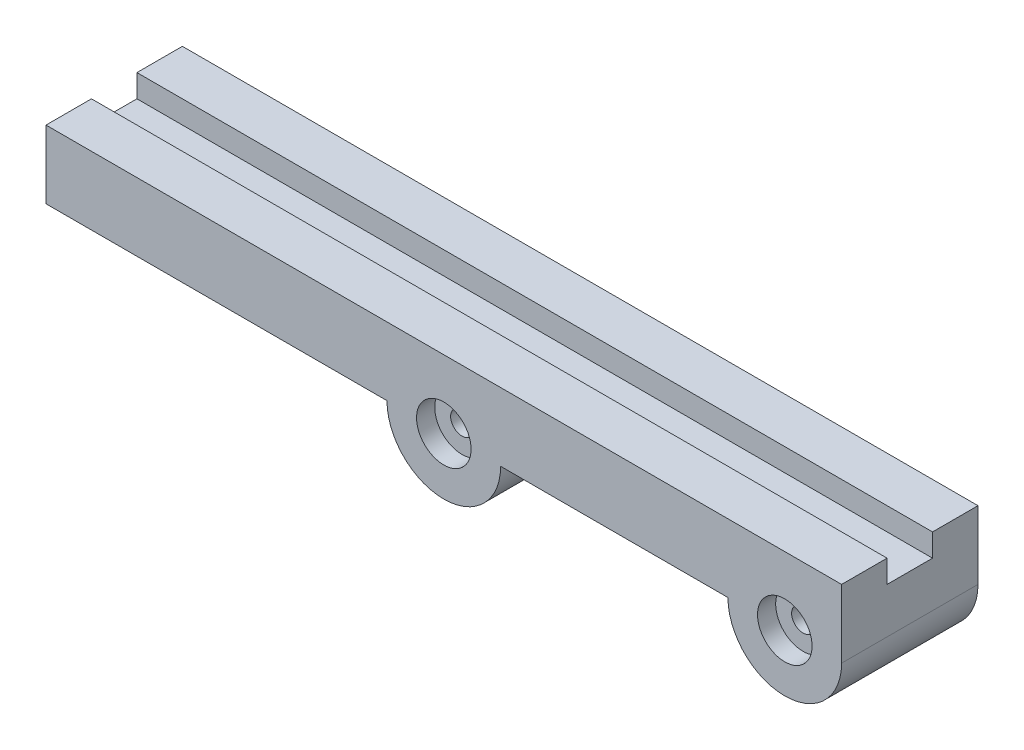
ISO-10303-21;
HEADER;
FILE_DESCRIPTION(('STEP AP214'),'2;1');
FILE_NAME('part.step','',(''),(''),'','','');
FILE_SCHEMA(('AUTOMOTIVE_DESIGN { 1 0 10303 214 1 1 1 1 }'));
ENDSEC;
DATA;
#1=APPLICATION_CONTEXT('core data for automotive mechanical design processes');
#2=APPLICATION_PROTOCOL_DEFINITION('international standard','automotive_design',2000,#1);
#3=PRODUCT_CONTEXT('',#1,'mechanical');
#4=PRODUCT('Part','Part','',(#3));
#5=PRODUCT_RELATED_PRODUCT_CATEGORY('part','',(#4));
#6=PRODUCT_DEFINITION_FORMATION('','',#4);
#7=PRODUCT_DEFINITION_CONTEXT('part definition',#1,'design');
#8=PRODUCT_DEFINITION('design','',#6,#7);
#9=PRODUCT_DEFINITION_SHAPE('','',#8);
#10=(LENGTH_UNIT() NAMED_UNIT(*) SI_UNIT(.MILLI.,.METRE.));
#11=(NAMED_UNIT(*) PLANE_ANGLE_UNIT() SI_UNIT($,.RADIAN.));
#12=(NAMED_UNIT(*) SI_UNIT($,.STERADIAN.) SOLID_ANGLE_UNIT());
#13=UNCERTAINTY_MEASURE_WITH_UNIT(LENGTH_MEASURE(1.E-05),#10,'distance_accuracy_value','');
#14=(GEOMETRIC_REPRESENTATION_CONTEXT(3) GLOBAL_UNCERTAINTY_ASSIGNED_CONTEXT((#13)) GLOBAL_UNIT_ASSIGNED_CONTEXT((#10,
#11,#12)) REPRESENTATION_CONTEXT('',''));
#15=CARTESIAN_POINT('',(0.,0.,0.));
#16=DIRECTION('',(0.,0.,1.));
#17=DIRECTION('',(1.,0.,0.));
#18=AXIS2_PLACEMENT_3D('',#15,#16,#17);
#19=CARTESIAN_POINT('',(0.,15.,30.));
#20=DIRECTION('',(0.,1.,0.));
#21=DIRECTION('',(-1.,0.,0.));
#22=AXIS2_PLACEMENT_3D('',#19,#20,#21);
#23=PLANE('',#22);
#24=DIRECTION('',(1.,0.,0.));
#25=VECTOR('',#24,1.);
#26=CARTESIAN_POINT('',(0.,15.,20.));
#27=LINE('',#26,#25);
#28=CARTESIAN_POINT('',(0.,15.,20.));
#29=VERTEX_POINT('',#28);
#30=CARTESIAN_POINT('',(175.,15.,20.));
#31=VERTEX_POINT('',#30);
#32=EDGE_CURVE('E274',#29,#31,#27,.T.);
#33=ORIENTED_EDGE('',*,*,#32,.F.);
#34=DIRECTION('',(0.,0.,-1.));
#35=VECTOR('',#34,1.);
#36=CARTESIAN_POINT('',(0.,15.,30.));
#37=LINE('',#36,#35);
#38=CARTESIAN_POINT('',(0.,15.,30.));
#39=VERTEX_POINT('',#38);
#40=EDGE_CURVE('E183',#39,#29,#37,.T.);
#41=ORIENTED_EDGE('',*,*,#40,.F.);
#42=DIRECTION('',(1.,0.,0.));
#43=VECTOR('',#42,1.);
#44=CARTESIAN_POINT('',(0.,15.,30.));
#45=LINE('',#44,#43);
#46=CARTESIAN_POINT('',(175.,15.,30.));
#47=VERTEX_POINT('',#46);
#48=EDGE_CURVE('E147',#39,#47,#45,.T.);
#49=ORIENTED_EDGE('',*,*,#48,.T.);
#50=DIRECTION('',(0.,0.,-1.));
#51=VECTOR('',#50,1.);
#52=CARTESIAN_POINT('',(175.,15.,30.));
#53=LINE('',#52,#51);
#54=EDGE_CURVE('E187',#47,#31,#53,.T.);
#55=ORIENTED_EDGE('',*,*,#54,.T.);
#56=EDGE_LOOP('',(#33,#41,#49,#55));
#57=FACE_BOUND('',#56,.T.);
#58=ADVANCED_FACE('F45',(#57),#23,.T.);
#59=CARTESIAN_POINT('',(162.5,0.,-0.001000000000001));
#60=DIRECTION('',(0.,0.,1.));
#61=DIRECTION('',(1.,0.,0.));
#62=AXIS2_PLACEMENT_3D('',#59,#60,#61);
#63=CYLINDRICAL_SURFACE('',#62,2.5);
#64=CARTESIAN_POINT('',(162.5,0.,0.));
#65=DIRECTION('',(0.,0.,1.));
#66=DIRECTION('',(1.,0.,0.));
#67=AXIS2_PLACEMENT_3D('',#64,#65,#66);
#68=CIRCLE('',#67,2.5);
#69=CARTESIAN_POINT('',(165.,0.,0.));
#70=VERTEX_POINT('',#69);
#71=EDGE_CURVE('E244',#70,#70,#68,.F.);
#72=ORIENTED_EDGE('',*,*,#71,.T.);
#73=EDGE_LOOP('',(#72));
#74=FACE_BOUND('',#73,.T.);
#75=CARTESIAN_POINT('',(162.5,0.,26.));
#76=DIRECTION('',(0.,0.,1.));
#77=DIRECTION('',(1.,0.,0.));
#78=AXIS2_PLACEMENT_3D('',#75,#76,#77);
#79=CIRCLE('',#78,2.5);
#80=CARTESIAN_POINT('',(165.,0.,26.));
#81=VERTEX_POINT('',#80);
#82=EDGE_CURVE('E249',#81,#81,#79,.T.);
#83=ORIENTED_EDGE('',*,*,#82,.T.);
#84=EDGE_LOOP('',(#83));
#85=FACE_BOUND('',#84,.T.);
#86=ADVANCED_FACE('F315',(#74,#85),#63,.F.);
#87=CARTESIAN_POINT('',(87.5,0.,-0.001000000000001));
#88=DIRECTION('',(0.,0.,1.));
#89=DIRECTION('',(1.,0.,0.));
#90=AXIS2_PLACEMENT_3D('',#87,#88,#89);
#91=CYLINDRICAL_SURFACE('',#90,2.5);
#92=CARTESIAN_POINT('',(87.5,0.,0.));
#93=DIRECTION('',(0.,0.,1.));
#94=DIRECTION('',(1.,0.,0.));
#95=AXIS2_PLACEMENT_3D('',#92,#93,#94);
#96=CIRCLE('',#95,2.5);
#97=CARTESIAN_POINT('',(90.,0.,0.));
#98=VERTEX_POINT('',#97);
#99=EDGE_CURVE('E163',#98,#98,#96,.F.);
#100=ORIENTED_EDGE('',*,*,#99,.T.);
#101=EDGE_LOOP('',(#100));
#102=FACE_BOUND('',#101,.T.);
#103=CARTESIAN_POINT('',(87.5,0.,26.));
#104=DIRECTION('',(0.,0.,1.));
#105=DIRECTION('',(1.,0.,0.));
#106=AXIS2_PLACEMENT_3D('',#103,#104,#105);
#107=CIRCLE('',#106,2.5);
#108=CARTESIAN_POINT('',(90.,0.,26.));
#109=VERTEX_POINT('',#108);
#110=EDGE_CURVE('E235',#109,#109,#107,.T.);
#111=ORIENTED_EDGE('',*,*,#110,.T.);
#112=EDGE_LOOP('',(#111));
#113=FACE_BOUND('',#112,.T.);
#114=ADVANCED_FACE('F312',(#102,#113),#91,.F.);
#115=CARTESIAN_POINT('',(0.,0.,30.));
#116=DIRECTION('',(0.,1.,0.));
#117=DIRECTION('',(-1.,0.,0.));
#118=AXIS2_PLACEMENT_3D('',#115,#116,#117);
#119=PLANE('',#118);
#120=DIRECTION('',(1.,0.,0.));
#121=VECTOR('',#120,1.);
#122=CARTESIAN_POINT('',(0.,0.,0.));
#123=LINE('',#122,#121);
#124=CARTESIAN_POINT('',(100.,0.,0.));
#125=VERTEX_POINT('',#124);
#126=CARTESIAN_POINT('',(150.,0.,0.));
#127=VERTEX_POINT('',#126);
#128=EDGE_CURVE('E158',#125,#127,#123,.T.);
#129=ORIENTED_EDGE('',*,*,#128,.T.);
#130=DIRECTION('',(0.,0.,-1.));
#131=VECTOR('',#130,1.);
#132=CARTESIAN_POINT('',(150.,0.,30.));
#133=LINE('',#132,#131);
#134=CARTESIAN_POINT('',(150.,0.,30.));
#135=VERTEX_POINT('',#134);
#136=EDGE_CURVE('E11',#135,#127,#133,.T.);
#137=ORIENTED_EDGE('',*,*,#136,.F.);
#138=DIRECTION('',(1.,0.,0.));
#139=VECTOR('',#138,1.);
#140=CARTESIAN_POINT('',(0.,0.,30.));
#141=LINE('',#140,#139);
#142=CARTESIAN_POINT('',(100.,0.,30.));
#143=VERTEX_POINT('',#142);
#144=EDGE_CURVE('E143',#143,#135,#141,.T.);
#145=ORIENTED_EDGE('',*,*,#144,.F.);
#146=DIRECTION('',(0.,0.,-1.));
#147=VECTOR('',#146,1.);
#148=CARTESIAN_POINT('',(100.,0.,30.));
#149=LINE('',#148,#147);
#150=EDGE_CURVE('E157',#143,#125,#149,.T.);
#151=ORIENTED_EDGE('',*,*,#150,.T.);
#152=EDGE_LOOP('',(#129,#137,#145,#151));
#153=FACE_BOUND('',#152,.T.);
#154=ADVANCED_FACE('F304',(#153),#119,.F.);
#155=CARTESIAN_POINT('',(162.5,0.,30.));
#156=DIRECTION('',(0.,0.,-1.));
#157=DIRECTION('',(-1.,0.,0.));
#158=AXIS2_PLACEMENT_3D('',#155,#156,#157);
#159=CYLINDRICAL_SURFACE('',#158,12.5);
#160=CARTESIAN_POINT('',(162.5,0.,0.));
#161=DIRECTION('',(0.,0.,1.));
#162=DIRECTION('',(1.,0.,0.));
#163=AXIS2_PLACEMENT_3D('',#160,#161,#162);
#164=CIRCLE('',#163,12.5);
#165=CARTESIAN_POINT('',(175.,0.,0.));
#166=VERTEX_POINT('',#165);
#167=EDGE_CURVE('E162',#127,#166,#164,.T.);
#168=ORIENTED_EDGE('',*,*,#167,.T.);
#169=DIRECTION('',(0.,0.,-1.));
#170=VECTOR('',#169,1.);
#171=CARTESIAN_POINT('',(175.,0.,30.));
#172=LINE('',#171,#170);
#173=CARTESIAN_POINT('',(175.,0.,30.));
#174=VERTEX_POINT('',#173);
#175=EDGE_CURVE('E54',#174,#166,#172,.T.);
#176=ORIENTED_EDGE('',*,*,#175,.F.);
#177=CARTESIAN_POINT('',(162.5,0.,30.));
#178=DIRECTION('',(0.,0.,1.));
#179=DIRECTION('',(1.,0.,0.));
#180=AXIS2_PLACEMENT_3D('',#177,#178,#179);
#181=CIRCLE('',#180,12.5);
#182=EDGE_CURVE('E108',#135,#174,#181,.T.);
#183=ORIENTED_EDGE('',*,*,#182,.F.);
#184=ORIENTED_EDGE('',*,*,#136,.T.);
#185=EDGE_LOOP('',(#168,#176,#183,#184));
#186=FACE_BOUND('',#185,.T.);
#187=ADVANCED_FACE('F47',(#186),#159,.T.);
#188=CARTESIAN_POINT('',(175.,3.23815048849004E-13,30.));
#189=DIRECTION('',(-1.,0.,0.));
#190=DIRECTION('',(0.,-1.,0.));
#191=AXIS2_PLACEMENT_3D('',#188,#189,#190);
#192=PLANE('',#191);
#193=DIRECTION('',(0.,0.,-1.));
#194=VECTOR('',#193,1.);
#195=CARTESIAN_POINT('',(175.,10.,20.));
#196=LINE('',#195,#194);
#197=CARTESIAN_POINT('',(175.,10.,20.));
#198=VERTEX_POINT('',#197);
#199=CARTESIAN_POINT('',(175.,10.,10.));
#200=VERTEX_POINT('',#199);
#201=EDGE_CURVE('E285',#198,#200,#196,.T.);
#202=ORIENTED_EDGE('',*,*,#201,.F.);
#203=DIRECTION('',(0.,1.,0.));
#204=VECTOR('',#203,1.);
#205=CARTESIAN_POINT('',(175.,10.,20.));
#206=LINE('',#205,#204);
#207=EDGE_CURVE('E228',#198,#31,#206,.T.);
#208=ORIENTED_EDGE('',*,*,#207,.T.);
#209=ORIENTED_EDGE('',*,*,#54,.F.);
#210=DIRECTION('',(0.,1.,0.));
#211=VECTOR('',#210,1.);
#212=CARTESIAN_POINT('',(175.,3.23815048849004E-13,30.));
#213=LINE('',#212,#211);
#214=EDGE_CURVE('E151',#174,#47,#213,.T.);
#215=ORIENTED_EDGE('',*,*,#214,.F.);
#216=ORIENTED_EDGE('',*,*,#175,.T.);
#217=DIRECTION('',(0.,1.,0.));
#218=VECTOR('',#217,1.);
#219=CARTESIAN_POINT('',(175.,3.23815048849004E-13,0.));
#220=LINE('',#219,#218);
#221=CARTESIAN_POINT('',(175.,15.,0.));
#222=VERTEX_POINT('',#221);
#223=EDGE_CURVE('E167',#166,#222,#220,.T.);
#224=ORIENTED_EDGE('',*,*,#223,.T.);
#225=CARTESIAN_POINT('',(175.,15.,10.));
#226=VERTEX_POINT('',#225);
#227=EDGE_CURVE('E186',#226,#222,#53,.T.);
#228=ORIENTED_EDGE('',*,*,#227,.F.);
#229=DIRECTION('',(0.,1.,0.));
#230=VECTOR('',#229,1.);
#231=CARTESIAN_POINT('',(175.,10.,10.));
#232=LINE('',#231,#230);
#233=EDGE_CURVE('E223',#200,#226,#232,.T.);
#234=ORIENTED_EDGE('',*,*,#233,.F.);
#235=EDGE_LOOP('',(#202,#208,#209,#215,#216,#224,#228,#234));
#236=FACE_BOUND('',#235,.T.);
#237=ADVANCED_FACE('F196',(#236),#192,.F.);
#238=DIRECTION('',(-1.,0.,0.));
#239=VECTOR('',#238,1.);
#240=CARTESIAN_POINT('',(0.,15.,10.));
#241=LINE('',#240,#239);
#242=CARTESIAN_POINT('',(0.,15.,10.));
#243=VERTEX_POINT('',#242);
#244=EDGE_CURVE('E210',#226,#243,#241,.T.);
#245=ORIENTED_EDGE('',*,*,#244,.F.);
#246=ORIENTED_EDGE('',*,*,#227,.T.);
#247=DIRECTION('',(1.,0.,0.));
#248=VECTOR('',#247,1.);
#249=CARTESIAN_POINT('',(0.,15.,0.));
#250=LINE('',#249,#248);
#251=CARTESIAN_POINT('',(0.,15.,0.));
#252=VERTEX_POINT('',#251);
#253=EDGE_CURVE('E171',#252,#222,#250,.T.);
#254=ORIENTED_EDGE('',*,*,#253,.F.);
#255=EDGE_CURVE('E135',#243,#252,#37,.T.);
#256=ORIENTED_EDGE('',*,*,#255,.F.);
#257=EDGE_LOOP('',(#245,#246,#254,#256));
#258=FACE_BOUND('',#257,.T.);
#259=ADVANCED_FACE('F206',(#258),#23,.T.);
#260=CARTESIAN_POINT('',(0.,0.,30.));
#261=DIRECTION('',(-1.,0.,0.));
#262=DIRECTION('',(0.,0.,1.));
#263=AXIS2_PLACEMENT_3D('',#260,#261,#262);
#264=PLANE('',#263);
#265=DIRECTION('',(0.,1.,0.));
#266=VECTOR('',#265,1.);
#267=CARTESIAN_POINT('',(0.,10.,20.));
#268=LINE('',#267,#266);
#269=CARTESIAN_POINT('',(0.,10.,20.));
#270=VERTEX_POINT('',#269);
#271=EDGE_CURVE('E222',#270,#29,#268,.T.);
#272=ORIENTED_EDGE('',*,*,#271,.F.);
#273=DIRECTION('',(0.,0.,1.));
#274=VECTOR('',#273,1.);
#275=CARTESIAN_POINT('',(0.,10.,20.));
#276=LINE('',#275,#274);
#277=CARTESIAN_POINT('',(0.,10.,10.));
#278=VERTEX_POINT('',#277);
#279=EDGE_CURVE('E217',#278,#270,#276,.T.);
#280=ORIENTED_EDGE('',*,*,#279,.F.);
#281=DIRECTION('',(0.,1.,0.));
#282=VECTOR('',#281,1.);
#283=CARTESIAN_POINT('',(0.,10.,10.));
#284=LINE('',#283,#282);
#285=EDGE_CURVE('E216',#278,#243,#284,.T.);
#286=ORIENTED_EDGE('',*,*,#285,.T.);
#287=ORIENTED_EDGE('',*,*,#255,.T.);
#288=DIRECTION('',(0.,1.,0.));
#289=VECTOR('',#288,1.);
#290=CARTESIAN_POINT('',(0.,0.,0.));
#291=LINE('',#290,#289);
#292=CARTESIAN_POINT('',(0.,0.,0.));
#293=VERTEX_POINT('',#292);
#294=EDGE_CURVE('E131',#293,#252,#291,.T.);
#295=ORIENTED_EDGE('',*,*,#294,.F.);
#296=DIRECTION('',(0.,0.,-1.));
#297=VECTOR('',#296,1.);
#298=CARTESIAN_POINT('',(0.,0.,30.));
#299=LINE('',#298,#297);
#300=CARTESIAN_POINT('',(0.,0.,30.));
#301=VERTEX_POINT('',#300);
#302=EDGE_CURVE('E123',#301,#293,#299,.T.);
#303=ORIENTED_EDGE('',*,*,#302,.F.);
#304=DIRECTION('',(0.,1.,0.));
#305=VECTOR('',#304,1.);
#306=CARTESIAN_POINT('',(0.,0.,30.));
#307=LINE('',#306,#305);
#308=EDGE_CURVE('E129',#301,#39,#307,.T.);
#309=ORIENTED_EDGE('',*,*,#308,.T.);
#310=ORIENTED_EDGE('',*,*,#40,.T.);
#311=EDGE_LOOP('',(#272,#280,#286,#287,#295,#303,#309,#310));
#312=FACE_BOUND('',#311,.T.);
#313=ADVANCED_FACE('F126',(#312),#264,.T.);
#314=CARTESIAN_POINT('',(75.,0.,0.));
#315=VERTEX_POINT('',#314);
#316=EDGE_CURVE('E164',#293,#315,#123,.T.);
#317=ORIENTED_EDGE('',*,*,#316,.T.);
#318=DIRECTION('',(0.,0.,-1.));
#319=VECTOR('',#318,1.);
#320=CARTESIAN_POINT('',(75.,0.,30.));
#321=LINE('',#320,#319);
#322=CARTESIAN_POINT('',(75.,0.,30.));
#323=VERTEX_POINT('',#322);
#324=EDGE_CURVE('E136',#323,#315,#321,.T.);
#325=ORIENTED_EDGE('',*,*,#324,.F.);
#326=EDGE_CURVE('E139',#301,#323,#141,.T.);
#327=ORIENTED_EDGE('',*,*,#326,.F.);
#328=ORIENTED_EDGE('',*,*,#302,.T.);
#329=EDGE_LOOP('',(#317,#325,#327,#328));
#330=FACE_BOUND('',#329,.T.);
#331=ADVANCED_FACE('F140',(#330),#119,.F.);
#332=CARTESIAN_POINT('',(87.5,0.,30.));
#333=DIRECTION('',(0.,0.,-1.));
#334=DIRECTION('',(-1.,0.,0.));
#335=AXIS2_PLACEMENT_3D('',#332,#333,#334);
#336=CYLINDRICAL_SURFACE('',#335,12.5);
#337=CARTESIAN_POINT('',(87.5,0.,0.));
#338=DIRECTION('',(0.,0.,1.));
#339=DIRECTION('',(1.,0.,0.));
#340=AXIS2_PLACEMENT_3D('',#337,#338,#339);
#341=CIRCLE('',#340,12.5);
#342=EDGE_CURVE('E100',#315,#125,#341,.T.);
#343=ORIENTED_EDGE('',*,*,#342,.T.);
#344=ORIENTED_EDGE('',*,*,#150,.F.);
#345=CARTESIAN_POINT('',(87.5,0.,30.));
#346=DIRECTION('',(0.,0.,1.));
#347=DIRECTION('',(1.,0.,0.));
#348=AXIS2_PLACEMENT_3D('',#345,#346,#347);
#349=CIRCLE('',#348,12.5);
#350=EDGE_CURVE('E70',#323,#143,#349,.T.);
#351=ORIENTED_EDGE('',*,*,#350,.F.);
#352=ORIENTED_EDGE('',*,*,#324,.T.);
#353=EDGE_LOOP('',(#343,#344,#351,#352));
#354=FACE_BOUND('',#353,.T.);
#355=ADVANCED_FACE('F301',(#354),#336,.T.);
#356=CARTESIAN_POINT('',(0.,0.,30.));
#357=DIRECTION('',(0.,0.,1.));
#358=DIRECTION('',(1.,0.,0.));
#359=AXIS2_PLACEMENT_3D('',#356,#357,#358);
#360=PLANE('',#359);
#361=CARTESIAN_POINT('',(87.5,0.,30.));
#362=DIRECTION('',(0.,0.,1.));
#363=DIRECTION('',(1.,0.,0.));
#364=AXIS2_PLACEMENT_3D('',#361,#362,#363);
#365=CIRCLE('',#364,6.);
#366=CARTESIAN_POINT('',(93.5,0.,30.));
#367=VERTEX_POINT('',#366);
#368=EDGE_CURVE('E240',#367,#367,#365,.T.);
#369=ORIENTED_EDGE('',*,*,#368,.F.);
#370=EDGE_LOOP('',(#369));
#371=FACE_BOUND('',#370,.T.);
#372=CARTESIAN_POINT('',(162.5,0.,30.));
#373=DIRECTION('',(0.,0.,1.));
#374=DIRECTION('',(1.,0.,0.));
#375=AXIS2_PLACEMENT_3D('',#372,#373,#374);
#376=CIRCLE('',#375,6.00000000000002);
#377=CARTESIAN_POINT('',(168.5,0.,30.));
#378=VERTEX_POINT('',#377);
#379=EDGE_CURVE('E253',#378,#378,#376,.T.);
#380=ORIENTED_EDGE('',*,*,#379,.F.);
#381=EDGE_LOOP('',(#380));
#382=FACE_BOUND('',#381,.T.);
#383=ORIENTED_EDGE('',*,*,#144,.T.);
#384=ORIENTED_EDGE('',*,*,#182,.T.);
#385=ORIENTED_EDGE('',*,*,#214,.T.);
#386=ORIENTED_EDGE('',*,*,#48,.F.);
#387=ORIENTED_EDGE('',*,*,#308,.F.);
#388=ORIENTED_EDGE('',*,*,#326,.T.);
#389=ORIENTED_EDGE('',*,*,#350,.T.);
#390=EDGE_LOOP('',(#383,#384,#385,#386,#387,#388,#389));
#391=FACE_BOUND('',#390,.T.);
#392=ADVANCED_FACE('F145',(#371,#382,#391),#360,.T.);
#393=CARTESIAN_POINT('',(0.,0.,0.));
#394=DIRECTION('',(0.,0.,1.));
#395=DIRECTION('',(1.,0.,0.));
#396=AXIS2_PLACEMENT_3D('',#393,#394,#395);
#397=PLANE('',#396);
#398=ORIENTED_EDGE('',*,*,#99,.F.);
#399=EDGE_LOOP('',(#398));
#400=FACE_BOUND('',#399,.T.);
#401=ORIENTED_EDGE('',*,*,#71,.F.);
#402=EDGE_LOOP('',(#401));
#403=FACE_BOUND('',#402,.T.);
#404=ORIENTED_EDGE('',*,*,#128,.F.);
#405=ORIENTED_EDGE('',*,*,#342,.F.);
#406=ORIENTED_EDGE('',*,*,#316,.F.);
#407=ORIENTED_EDGE('',*,*,#294,.T.);
#408=ORIENTED_EDGE('',*,*,#253,.T.);
#409=ORIENTED_EDGE('',*,*,#223,.F.);
#410=ORIENTED_EDGE('',*,*,#167,.F.);
#411=EDGE_LOOP('',(#404,#405,#406,#407,#408,#409,#410));
#412=FACE_BOUND('',#411,.T.);
#413=ADVANCED_FACE('F201',(#400,#403,#412),#397,.F.);
#414=CARTESIAN_POINT('',(87.5,0.,26.));
#415=DIRECTION('',(0.,0.,1.));
#416=DIRECTION('',(1.,0.,0.));
#417=AXIS2_PLACEMENT_3D('',#414,#415,#416);
#418=CYLINDRICAL_SURFACE('',#417,6.);
#419=CARTESIAN_POINT('',(87.5,0.,26.));
#420=DIRECTION('',(0.,0.,1.));
#421=DIRECTION('',(1.,0.,0.));
#422=AXIS2_PLACEMENT_3D('',#419,#420,#421);
#423=CIRCLE('',#422,6.);
#424=CARTESIAN_POINT('',(93.5,0.,26.));
#425=VERTEX_POINT('',#424);
#426=EDGE_CURVE('E239',#425,#425,#423,.T.);
#427=ORIENTED_EDGE('',*,*,#426,.F.);
#428=EDGE_LOOP('',(#427));
#429=FACE_BOUND('',#428,.T.);
#430=ORIENTED_EDGE('',*,*,#368,.T.);
#431=EDGE_LOOP('',(#430));
#432=FACE_BOUND('',#431,.T.);
#433=ADVANCED_FACE('F336',(#429,#432),#418,.F.);
#434=CARTESIAN_POINT('',(0.,0.,26.));
#435=DIRECTION('',(0.,0.,1.));
#436=DIRECTION('',(1.,0.,0.));
#437=AXIS2_PLACEMENT_3D('',#434,#435,#436);
#438=PLANE('',#437);
#439=ORIENTED_EDGE('',*,*,#110,.F.);
#440=EDGE_LOOP('',(#439));
#441=FACE_BOUND('',#440,.T.);
#442=ORIENTED_EDGE('',*,*,#426,.T.);
#443=EDGE_LOOP('',(#442));
#444=FACE_BOUND('',#443,.T.);
#445=ADVANCED_FACE('F348',(#441,#444),#438,.T.);
#446=CARTESIAN_POINT('',(162.5,0.,26.));
#447=DIRECTION('',(0.,0.,1.));
#448=DIRECTION('',(1.,0.,0.));
#449=AXIS2_PLACEMENT_3D('',#446,#447,#448);
#450=CYLINDRICAL_SURFACE('',#449,6.00000000000002);
#451=CARTESIAN_POINT('',(162.5,0.,26.));
#452=DIRECTION('',(0.,0.,1.));
#453=DIRECTION('',(1.,0.,0.));
#454=AXIS2_PLACEMENT_3D('',#451,#452,#453);
#455=CIRCLE('',#454,6.00000000000002);
#456=CARTESIAN_POINT('',(168.5,0.,26.));
#457=VERTEX_POINT('',#456);
#458=EDGE_CURVE('E248',#457,#457,#455,.T.);
#459=ORIENTED_EDGE('',*,*,#458,.F.);
#460=EDGE_LOOP('',(#459));
#461=FACE_BOUND('',#460,.T.);
#462=ORIENTED_EDGE('',*,*,#379,.T.);
#463=EDGE_LOOP('',(#462));
#464=FACE_BOUND('',#463,.T.);
#465=ADVANCED_FACE('F344',(#461,#464),#450,.F.);
#466=CARTESIAN_POINT('',(0.,0.,26.));
#467=DIRECTION('',(0.,0.,1.));
#468=DIRECTION('',(1.,0.,0.));
#469=AXIS2_PLACEMENT_3D('',#466,#467,#468);
#470=PLANE('',#469);
#471=ORIENTED_EDGE('',*,*,#82,.F.);
#472=EDGE_LOOP('',(#471));
#473=FACE_BOUND('',#472,.T.);
#474=ORIENTED_EDGE('',*,*,#458,.T.);
#475=EDGE_LOOP('',(#474));
#476=FACE_BOUND('',#475,.T.);
#477=ADVANCED_FACE('F347',(#473,#476),#470,.T.);
#478=CARTESIAN_POINT('',(0.,10.,20.));
#479=DIRECTION('',(0.,0.,1.));
#480=DIRECTION('',(1.,0.,0.));
#481=AXIS2_PLACEMENT_3D('',#478,#479,#480);
#482=PLANE('',#481);
#483=ORIENTED_EDGE('',*,*,#32,.T.);
#484=ORIENTED_EDGE('',*,*,#207,.F.);
#485=DIRECTION('',(1.,0.,0.));
#486=VECTOR('',#485,1.);
#487=CARTESIAN_POINT('',(0.,10.,20.));
#488=LINE('',#487,#486);
#489=EDGE_CURVE('E231',#270,#198,#488,.T.);
#490=ORIENTED_EDGE('',*,*,#489,.F.);
#491=ORIENTED_EDGE('',*,*,#271,.T.);
#492=EDGE_LOOP('',(#483,#484,#490,#491));
#493=FACE_BOUND('',#492,.T.);
#494=ADVANCED_FACE('F351',(#493),#482,.F.);
#495=CARTESIAN_POINT('',(0.,10.,10.));
#496=DIRECTION('',(0.,0.,-1.));
#497=DIRECTION('',(-1.,0.,0.));
#498=AXIS2_PLACEMENT_3D('',#495,#496,#497);
#499=PLANE('',#498);
#500=ORIENTED_EDGE('',*,*,#244,.T.);
#501=ORIENTED_EDGE('',*,*,#285,.F.);
#502=DIRECTION('',(-1.,0.,0.));
#503=VECTOR('',#502,1.);
#504=CARTESIAN_POINT('',(0.,10.,10.));
#505=LINE('',#504,#503);
#506=EDGE_CURVE('E61',#200,#278,#505,.T.);
#507=ORIENTED_EDGE('',*,*,#506,.F.);
#508=ORIENTED_EDGE('',*,*,#233,.T.);
#509=EDGE_LOOP('',(#500,#501,#507,#508));
#510=FACE_BOUND('',#509,.T.);
#511=ADVANCED_FACE('F283',(#510),#499,.F.);
#512=CARTESIAN_POINT('',(0.,10.,0.));
#513=DIRECTION('',(0.,-1.,0.));
#514=DIRECTION('',(1.,0.,0.));
#515=AXIS2_PLACEMENT_3D('',#512,#513,#514);
#516=PLANE('',#515);
#517=ORIENTED_EDGE('',*,*,#201,.T.);
#518=ORIENTED_EDGE('',*,*,#506,.T.);
#519=ORIENTED_EDGE('',*,*,#279,.T.);
#520=ORIENTED_EDGE('',*,*,#489,.T.);
#521=EDGE_LOOP('',(#517,#518,#519,#520));
#522=FACE_BOUND('',#521,.T.);
#523=ADVANCED_FACE('F288',(#522),#516,.F.);
#524=CLOSED_SHELL('',(#58,#86,#114,#154,#187,#237,#259,#313,#331,#355,#392,#413,#433,#445,#465,
#477,#494,#511,#523));
#525=MANIFOLD_SOLID_BREP('B2',#524);
#526=ADVANCED_BREP_SHAPE_REPRESENTATION('',(#18,#525),#14);
#527=SHAPE_DEFINITION_REPRESENTATION(#9,#526);
ENDSEC;
END-ISO-10303-21;
